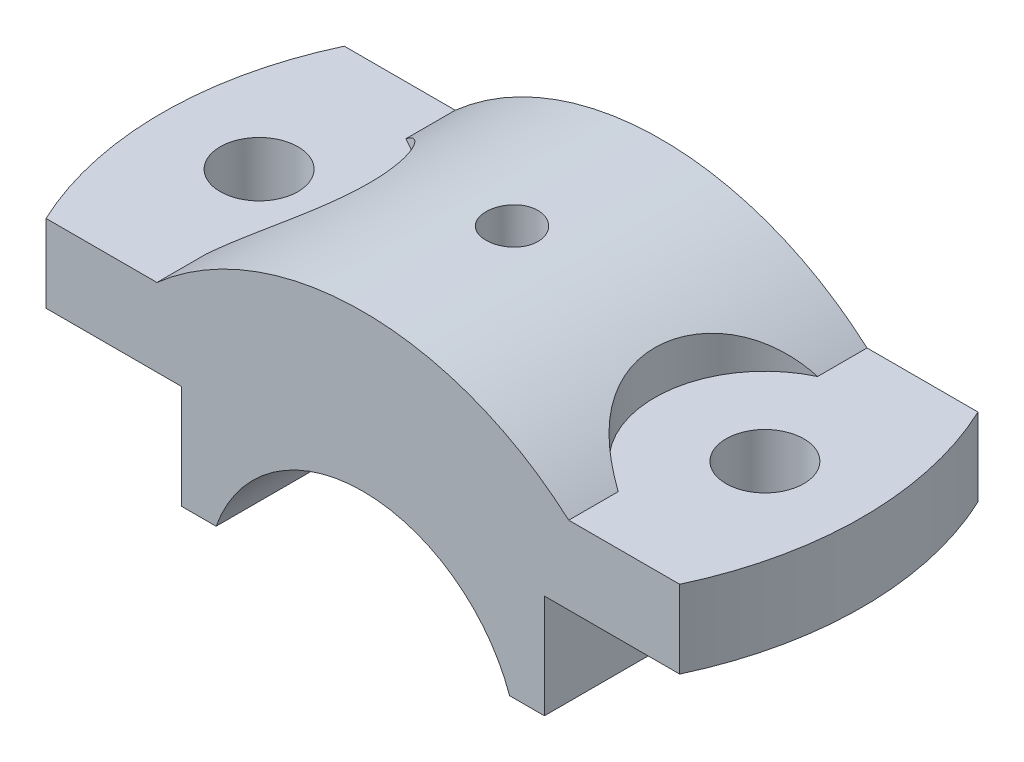
ISO-10303-21;
HEADER;
FILE_DESCRIPTION(('STEP AP214'),'2;1');
FILE_NAME('part.step','',(''),(''),'','','');
FILE_SCHEMA(('AUTOMOTIVE_DESIGN { 1 0 10303 214 1 1 1 1 }'));
ENDSEC;
DATA;
#1=APPLICATION_CONTEXT('core data for automotive mechanical design processes');
#2=APPLICATION_PROTOCOL_DEFINITION('international standard','automotive_design',2000,#1);
#3=PRODUCT_CONTEXT('',#1,'mechanical');
#4=PRODUCT('Part','Part','',(#3));
#5=PRODUCT_RELATED_PRODUCT_CATEGORY('part','',(#4));
#6=PRODUCT_DEFINITION_FORMATION('','',#4);
#7=PRODUCT_DEFINITION_CONTEXT('part definition',#1,'design');
#8=PRODUCT_DEFINITION('design','',#6,#7);
#9=PRODUCT_DEFINITION_SHAPE('','',#8);
#10=(LENGTH_UNIT() NAMED_UNIT(*) SI_UNIT(.MILLI.,.METRE.));
#11=(NAMED_UNIT(*) PLANE_ANGLE_UNIT() SI_UNIT($,.RADIAN.));
#12=(NAMED_UNIT(*) SI_UNIT($,.STERADIAN.) SOLID_ANGLE_UNIT());
#13=UNCERTAINTY_MEASURE_WITH_UNIT(LENGTH_MEASURE(1.E-05),#10,'distance_accuracy_value','');
#14=(GEOMETRIC_REPRESENTATION_CONTEXT(3) GLOBAL_UNCERTAINTY_ASSIGNED_CONTEXT((#13)) GLOBAL_UNIT_ASSIGNED_CONTEXT((#10,
#11,#12)) REPRESENTATION_CONTEXT('',''));
#15=CARTESIAN_POINT('',(0.,0.,0.));
#16=DIRECTION('',(0.,0.,1.));
#17=DIRECTION('',(1.,0.,0.));
#18=AXIS2_PLACEMENT_3D('',#15,#16,#17);
#19=CARTESIAN_POINT('',(0.,-16.,0.));
#20=DIRECTION('',(0.,1.,0.));
#21=DIRECTION('',(0.,0.,1.));
#22=AXIS2_PLACEMENT_3D('',#19,#20,#21);
#23=CYLINDRICAL_SURFACE('',#22,3.);
#24=CARTESIAN_POINT('',(0.,0.,2.99999999999989));
#25=CARTESIAN_POINT('',(-0.167809314666925,-2.34124285282648E-06,2.99999287087702));
#26=CARTESIAN_POINT('',(-0.335723489163323,-0.00177858534120809,2.98587254499684));
#27=CARTESIAN_POINT('',(-0.666879362507734,-0.00869351866368343,2.92976669451505));
#28=CARTESIAN_POINT('',(-0.830115996748512,-0.0138357187028007,2.88775207449186));
#29=CARTESIAN_POINT('',(-1.14707468977568,-0.0269032674670727,2.777114827303));
#30=CARTESIAN_POINT('',(-1.3008030721754,-0.0348267425334952,2.70851010982813));
#31=CARTESIAN_POINT('',(-1.59453536987169,-0.0525755894628661,2.54667925923625));
#32=CARTESIAN_POINT('',(-1.73454163386769,-0.0624006349906302,2.45345734976314));
#33=CARTESIAN_POINT('',(-1.99765538031762,-0.0829161443240986,2.24448966019248));
#34=CARTESIAN_POINT('',(-2.12067643792458,-0.0936106236910096,2.12863544478449));
#35=CARTESIAN_POINT('',(-2.345583352269,-0.11462728788302,1.87792461175601));
#36=CARTESIAN_POINT('',(-2.44746813167071,-0.124949453708809,1.74306702610409));
#37=CARTESIAN_POINT('',(-2.62753219354073,-0.144092332565006,1.4576160269212));
#38=CARTESIAN_POINT('',(-2.70563051512928,-0.152907873865083,1.30697116611847));
#39=CARTESIAN_POINT('',(-2.83538769189013,-0.167986458507823,0.994575537663192));
#40=CARTESIAN_POINT('',(-2.88704754967826,-0.174249598642391,0.83282519142362));
#41=CARTESIAN_POINT('',(-2.96219877602972,-0.183475924756665,0.50370696529592));
#42=CARTESIAN_POINT('',(-2.98583605767803,-0.186456198759096,0.336372890754994));
#43=CARTESIAN_POINT('',(-3.00472265946868,-0.188831662286497,8.84838338013145E-05));
#44=CARTESIAN_POINT('',(-2.99997312120293,-0.188226995981864,-0.16886178327756));
#45=CARTESIAN_POINT('',(-2.96234068373751,-0.183516535562941,-0.502565792698541));
#46=CARTESIAN_POINT('',(-2.92961851558165,-0.179430744476067,-0.667337983440298));
#47=CARTESIAN_POINT('',(-2.83722045981847,-0.168249602908488,-0.989034025462718));
#48=CARTESIAN_POINT('',(-2.77754402610229,-0.161154191451328,-1.14595771765675));
#49=CARTESIAN_POINT('',(-2.63275867189401,-0.144730609624185,-1.44800159882593));
#50=CARTESIAN_POINT('',(-2.54757990444922,-0.135396321462685,-1.59308796029872));
#51=CARTESIAN_POINT('',(-2.35425776334833,-0.115551462832858,-1.86696803329584));
#52=CARTESIAN_POINT('',(-2.2461133392969,-0.105040838572076,-1.99576099916834));
#53=CARTESIAN_POINT('',(-2.00903893290448,-0.0839386813149285,-2.23433125286723));
#54=CARTESIAN_POINT('',(-1.87997040940799,-0.0733470913573495,-2.34397091011915));
#55=CARTESIAN_POINT('',(-1.60518860293672,-0.0533444093297723,-2.54005065603669));
#56=CARTESIAN_POINT('',(-1.45947528158194,-0.0439333199819089,-2.62649069120646));
#57=CARTESIAN_POINT('',(-1.15543400563622,-0.0273461733770146,-2.77371758455675));
#58=CARTESIAN_POINT('',(-0.997101834405292,-0.0201708671815613,-2.83449582465749));
#59=CARTESIAN_POINT('',(-0.67236952851729,-0.00887057063930211,-2.92856459222787));
#60=CARTESIAN_POINT('',(-0.505969771956821,-0.0047454374896157,-2.9618564065644));
#61=CARTESIAN_POINT('',(-0.171015796696215,-2.88430709210897E-05,-2.99982890911262));
#62=CARTESIAN_POINT('',(-0.00248338823834651,0.000586033711596729,-3.00469919083687));
#63=CARTESIAN_POINT('',(0.332995243796977,-0.00172394393485412,-2.98619071913288));
#64=CARTESIAN_POINT('',(0.499941501077628,-0.00464872298145566,-2.96281256729812));
#65=CARTESIAN_POINT('',(0.826949409265802,-0.013694774919713,-2.88862834947076));
#66=CARTESIAN_POINT('',(0.987031884509617,-0.0198055102336021,-2.83791268391685));
#67=CARTESIAN_POINT('',(1.29641958583007,-0.0345393227976434,-2.71058705770451));
#68=CARTESIAN_POINT('',(1.44572444575838,-0.0431624853525068,-2.63397621781031));
#69=CARTESIAN_POINT('',(1.7301654248249,-0.0620181250786363,-2.45657623499108));
#70=CARTESIAN_POINT('',(1.86522451193256,-0.0722586714898925,-2.35566445223326));
#71=CARTESIAN_POINT('',(2.11655638755155,-0.0931782920921583,-2.13270060295899));
#72=CARTESIAN_POINT('',(2.23282843000421,-0.103857383677274,-2.01064769729887));
#73=CARTESIAN_POINT('',(2.4439583505816,-0.124522734449034,-1.74803109989151));
#74=CARTESIAN_POINT('',(2.53869055268148,-0.134504703344098,-1.6073659844276));
#75=CARTESIAN_POINT('',(2.70318346733217,-0.152575067554229,-1.31201010617441));
#76=CARTESIAN_POINT('',(2.77294468047402,-0.160663500827701,-1.15731962462825));
#77=CARTESIAN_POINT('',(2.88531189463984,-0.174001795284092,-0.838709617022925));
#78=CARTESIAN_POINT('',(2.92798875294853,-0.179259057782567,-0.674815403942471));
#79=CARTESIAN_POINT('',(2.98520399264141,-0.186361009110554,-0.342117019463194));
#80=CARTESIAN_POINT('',(2.99974368304291,-0.18820585669468,-0.173313076849172));
#81=CARTESIAN_POINT('',(3.0002478433018,-0.18826947621054,0.163162715045651));
#82=CARTESIAN_POINT('',(2.98640975723914,-0.186513302976572,0.330834297998293));
#83=CARTESIAN_POINT('',(2.93096928581918,-0.179626625553606,0.66144855521409));
#84=CARTESIAN_POINT('',(2.88936689748687,-0.174496121003041,0.82439122897053));
#85=CARTESIAN_POINT('',(2.77964048842754,-0.161446610705414,1.14089634811966));
#86=CARTESIAN_POINT('',(2.71152597716511,-0.153528604886608,1.29446213402618));
#87=CARTESIAN_POINT('',(2.55072828258037,-0.135794601062196,1.588015984858));
#88=CARTESIAN_POINT('',(2.45804479141149,-0.125978579275079,1.72800387962382));
#89=CARTESIAN_POINT('',(2.25000759751896,-0.105472742973237,1.99143747040859));
#90=CARTESIAN_POINT('',(2.13450675092991,-0.094777534991636,2.114766553146));
#91=CARTESIAN_POINT('',(1.88442027236202,-0.073766020885196,2.34036819020162));
#92=CARTESIAN_POINT('',(1.74983014696984,-0.0634498046928832,2.44263577292924));
#93=CARTESIAN_POINT('',(1.46479874502501,-0.04431532095902,2.6235424285264));
#94=CARTESIAN_POINT('',(1.31429913551536,-0.0355028990604096,2.70209016707912));
#95=CARTESIAN_POINT('',(1.00221948276152,-0.0204282110793104,2.83268549149955));
#96=CARTESIAN_POINT('',(0.840651697044306,-0.0141631755650562,2.88476187162419));
#97=CARTESIAN_POINT('',(0.565206926361551,-0.00639935606702067,2.94847120580561));
#98=CARTESIAN_POINT('',(0.453066796220337,-0.00401128925456732,2.96776673037851));
#99=CARTESIAN_POINT('',(0.227300475854938,-0.000810824049763366,2.99353349483183));
#100=CARTESIAN_POINT('',(0.113674296595242,1.58596163140247E-06,3.00000482927906));
#101=CARTESIAN_POINT('',(0.,0.,2.99999999999989));
#102=B_SPLINE_CURVE_WITH_KNOTS('',3,(#24,#25,#26,#27,#28,#29,#30,#31,#32,#33,#34,#35,#36,#37,
#38,#39,#40,#41,#42,#43,#44,#45,#46,#47,#48,#49,#50,#51,#52,#53,#54,#55,#56,#57,#58,#59,#60,#61,
#62,#63,#64,#65,#66,#67,#68,#69,#70,#71,#72,#73,#74,#75,#76,#77,#78,#79,#80,#81,#82,#83,#84,#85,
#86,#87,#88,#89,#90,#91,#92,#93,#94,#95,#96,#97,#98,#99,#100,#101),.UNSPECIFIED.,.T.,.F.,(4,2,2,
2,2,2,2,2,2,2,2,2,2,2,2,2,2,2,2,2,2,2,2,2,2,2,2,2,2,2,2,2,2,2,2,2,2,2,4),(0.,0.503012727331519,
1.00655095313214,1.50975060981815,2.0128639870929,2.51844975842213,3.02406129360013,
3.5313750038264,4.03866947396162,4.54331070343582,5.04793163861597,5.54967235730025,
6.05142324199477,6.55456111542631,7.05772200616363,7.56436173763698,8.07100263735734,
8.57781354877921,9.08460073084532,9.58800335270302,10.0913952540231,10.5931326467207,
11.0948870769473,11.599228835141,12.103590616501,12.6108236580908,13.1180465306584,
13.6239368913711,14.1298037161275,14.6321628144266,15.1345219665545,15.6367010964779,
16.1388865189472,16.644422852302,17.1500783816402,17.6576568364423,18.1646819842084,
18.5054261182515,18.8461677396052),.UNSPECIFIED.);
#103=CARTESIAN_POINT('',(0.,0.,2.99999999999989));
#104=VERTEX_POINT('',#103);
#105=EDGE_CURVE('E337',#104,#104,#102,.T.);
#106=ORIENTED_EDGE('',*,*,#105,.T.);
#107=EDGE_LOOP('',(#106));
#108=FACE_BOUND('',#107,.T.);
#109=CARTESIAN_POINT('',(0.,8.00000000000001,0.));
#110=DIRECTION('',(0.,1.,0.));
#111=DIRECTION('',(0.,0.,1.));
#112=AXIS2_PLACEMENT_3D('',#109,#110,#111);
#113=CIRCLE('',#112,3.);
#114=CARTESIAN_POINT('',(0.,8.00000000000001,3.));
#115=VERTEX_POINT('',#114);
#116=EDGE_CURVE('E345',#115,#115,#113,.F.);
#117=ORIENTED_EDGE('',*,*,#116,.F.);
#118=EDGE_LOOP('',(#117));
#119=FACE_BOUND('',#118,.T.);
#120=ADVANCED_FACE('F43',(#108,#119),#23,.F.);
#121=CARTESIAN_POINT('',(0.,-24.,-87.621977685614));
#122=DIRECTION('',(0.,0.,1.));
#123=DIRECTION('',(1.,0.,0.));
#124=AXIS2_PLACEMENT_3D('',#121,#122,#123);
#125=CYLINDRICAL_SURFACE('',#124,48.);
#126=CARTESIAN_POINT('',(0.,24.,4.));
#127=CARTESIAN_POINT('',(0.224264359684817,23.9999978164607,3.99999020469489));
#128=CARTESIAN_POINT('',(0.448681388720903,23.9984115417359,3.98107612075584));
#129=CARTESIAN_POINT('',(0.89130628280155,23.99223609313,3.90590259257967));
#130=CARTESIAN_POINT('',(1.1095068209009,23.9876435172678,3.84960083878032));
#131=CARTESIAN_POINT('',(1.53322409005702,23.9759744498441,3.70129138476245));
#132=CARTESIAN_POINT('',(1.73874792169845,23.9688993639394,3.60930388756071));
#133=CARTESIAN_POINT('',(2.13138893366429,23.9530587097885,3.39227027251206));
#134=CARTESIAN_POINT('',(2.31851003954153,23.9442935032543,3.26723122609003));
#135=CARTESIAN_POINT('',(2.66955999986234,23.9260311946685,2.98729973357608));
#136=CARTESIAN_POINT('',(2.83343548966463,23.9165324834631,2.83234046425729));
#137=CARTESIAN_POINT('',(3.13288453414622,23.8978872321267,2.49710841660024));
#138=CARTESIAN_POINT('',(3.26845684548604,23.8887407074815,2.31683452678944));
#139=CARTESIAN_POINT('',(3.50763168956092,23.8718181064497,1.93576753160381));
#140=CARTESIAN_POINT('',(3.61118733180617,23.8640440472037,1.73494489838886));
#141=CARTESIAN_POINT('',(3.78308973509539,23.8507649779309,1.31868681777608));
#142=CARTESIAN_POINT('',(3.85143711804971,23.8452599278252,1.10325162856705));
#143=CARTESIAN_POINT('',(3.95082811927432,23.8371556826528,0.664418432475385));
#144=CARTESIAN_POINT('',(3.98195866155911,23.8345497174487,0.441040240029685));
#145=CARTESIAN_POINT('',(4.00630083206169,23.832517292859,-0.00778481578137484));
#146=CARTESIAN_POINT('',(3.99951317191813,23.8330907738024,-0.233231640243924));
#147=CARTESIAN_POINT('',(3.94828345685938,23.8373462944655,-0.679198662042014));
#148=CARTESIAN_POINT('',(3.90393587215223,23.8410205351141,-0.899729796305594));
#149=CARTESIAN_POINT('',(3.77899194153178,23.8510513427746,-1.33020746957179));
#150=CARTESIAN_POINT('',(3.69839524158717,23.8574079359839,-1.5401539051754));
#151=CARTESIAN_POINT('',(3.50313515260815,23.8720961882741,-1.9438036235124));
#152=CARTESIAN_POINT('',(3.38842937902876,23.8804303020385,-2.13748631035005));
#153=CARTESIAN_POINT('',(3.12823777565335,23.8981322745552,-2.50288535527928));
#154=CARTESIAN_POINT('',(2.98275132249014,23.9075001542412,-2.67460126838897));
#155=CARTESIAN_POINT('',(2.6645983289054,23.9262488164658,-2.99174167712636));
#156=CARTESIAN_POINT('',(2.49185011756221,23.9356295510026,-3.13708425651706));
#157=CARTESIAN_POINT('',(2.12436222548692,23.9533196747933,-3.39671889355427));
#158=CARTESIAN_POINT('',(1.9296225300613,23.9616290633314,-3.51101093045434));
#159=CARTESIAN_POINT('',(1.52362637307139,23.9762418323856,-3.70529505067492));
#160=CARTESIAN_POINT('',(1.31236816723627,23.9825450006977,-3.78528350591266));
#161=CARTESIAN_POINT('',(0.879356276078311,23.9924326964719,-3.90863252980529));
#162=CARTESIAN_POINT('',(0.657602808675426,23.9960172803554,-3.95199385862102));
#163=CARTESIAN_POINT('',(0.210605200657015,24.000056677722,-4.00075505616631));
#164=CARTESIAN_POINT('',(-0.0146265164607891,24.00052081968,-4.00626807242761));
#165=CARTESIAN_POINT('',(-0.462811010013239,23.998291951148,-3.97947255749071));
#166=CARTESIAN_POINT('',(-0.685763807685683,23.995598970107,-3.94716437908208));
#167=CARTESIAN_POINT('',(-1.12273902489884,23.9873647136528,-3.84573736555953));
#168=CARTESIAN_POINT('',(-1.33677370055894,23.9818274966968,-3.77667097589671));
#169=CARTESIAN_POINT('',(-1.75021666033001,23.968526804494,-3.60374164887188));
#170=CARTESIAN_POINT('',(-1.94962471313258,23.9607632940497,-3.499878161366));
#171=CARTESIAN_POINT('',(-2.32866887320764,23.9438570557453,-3.26001860313458));
#172=CARTESIAN_POINT('',(-2.50825740208586,23.9347111287494,-3.1239475744207));
#173=CARTESIAN_POINT('',(-2.84208437937444,23.9160783455879,-2.82364377179811));
#174=CARTESIAN_POINT('',(-2.9963223872575,23.9065914835011,-2.65941050860301));
#175=CARTESIAN_POINT('',(-3.27545818182037,23.8883184486329,-2.30695323120673));
#176=CARTESIAN_POINT('',(-3.40028213293451,23.8795340749689,-2.11867063521046));
#177=CARTESIAN_POINT('',(-3.61654025135806,23.8636860697728,-1.72375094854637));
#178=CARTESIAN_POINT('',(-3.70797475203989,23.8566224210607,-1.51711404116027));
#179=CARTESIAN_POINT('',(-3.85473270976229,23.8450257139577,-1.09161283784306));
#180=CARTESIAN_POINT('',(-3.91010136579716,23.8404894891454,-0.872764221142673));
#181=CARTESIAN_POINT('',(-3.98330307964062,23.834450627634,-0.428837200502284));
#182=CARTESIAN_POINT('',(-4.00113685827311,23.8329479326787,-0.2037589162816));
#183=CARTESIAN_POINT('',(-3.99875425156376,23.8331471180078,0.2455045040836));
#184=CARTESIAN_POINT('',(-3.97865387910956,23.8348392277227,0.469690268945764));
#185=CARTESIAN_POINT('',(-3.90121545318012,23.8412166032922,0.91149013420342));
#186=CARTESIAN_POINT('',(-3.84387734291056,23.8459018737118,1.12910422457538));
#187=CARTESIAN_POINT('',(-3.6936204400683,23.8577350852682,1.5515910530665));
#188=CARTESIAN_POINT('',(-3.60070373602614,23.8648828818476,1.75646453826277));
#189=CARTESIAN_POINT('',(-3.38194023578897,23.8808359950028,2.14772336229469));
#190=CARTESIAN_POINT('',(-3.2560939564582,23.8896412855619,2.33410899125333));
#191=CARTESIAN_POINT('',(-2.97460776848978,23.9079492679473,2.68369495605207));
#192=CARTESIAN_POINT('',(-2.81888197496584,23.9174539202297,2.84682603462942));
#193=CARTESIAN_POINT('',(-2.48221290236986,23.9360718003871,3.14470074081324));
#194=CARTESIAN_POINT('',(-2.30126353056436,23.945184932993,3.27943748998396));
#195=CARTESIAN_POINT('',(-1.91893509211767,23.962009393691,3.51687944167016));
#196=CARTESIAN_POINT('',(-1.7175186250822,23.9697180809241,3.61952455462528));
#197=CARTESIAN_POINT('',(-1.30038300798299,23.982834100652,3.7894072122051));
#198=CARTESIAN_POINT('',(-1.08468062165464,23.9882440771302,3.85668545715234));
#199=CARTESIAN_POINT('',(-0.723088192386746,23.994764309354,3.93679033000813));
#200=CARTESIAN_POINT('',(-0.57952357775391,23.9967187550781,3.96046245006993));
#201=CARTESIAN_POINT('',(-0.290660686004667,23.9993373063453,3.99207043870883));
#202=CARTESIAN_POINT('',(-0.145362413492189,24.0000014153143,4.00000634906588));
#203=CARTESIAN_POINT('',(0.,24.,4.));
#204=B_SPLINE_CURVE_WITH_KNOTS('',3,(#126,#127,#128,#129,#130,#131,#132,#133,#134,#135,#136,
#137,#138,#139,#140,#141,#142,#143,#144,#145,#146,#147,#148,#149,#150,#151,#152,#153,#154,#155,
#156,#157,#158,#159,#160,#161,#162,#163,#164,#165,#166,#167,#168,#169,#170,#171,#172,#173,#174,
#175,#176,#177,#178,#179,#180,#181,#182,#183,#184,#185,#186,#187,#188,#189,#190,#191,#192,#193,
#194,#195,#196,#197,#198,#199,#200,#201,#202,#203),.UNSPECIFIED.,.T.,.F.,(4,2,2,2,2,2,2,2,2,2,2,
2,2,2,2,2,2,2,2,2,2,2,2,2,2,2,2,2,2,2,2,2,2,2,2,2,2,2,4),(0.,0.672262347200549,1.34528675599135,
2.01793069555579,2.69043083833664,3.36445067514305,4.03850011495735,4.71353211804367,
5.38855219711595,6.06199259326336,6.73542035050467,7.40715932441154,8.07890485907993,
8.75148862995601,9.42408602323452,10.0987380374061,10.7733905023459,11.4481143036181,
12.1228241013014,12.7955159722868,13.4682015685689,14.1399299612315,14.8116689744549,
15.484986998997,16.1583167228499,16.833319059648,17.5083146567931,18.1824626896372,
18.8565977759504,19.5286745153011,20.2007522796936,20.872790597901,21.5448183683943,
22.2188075465856,22.8929598092992,23.5683669225021,24.2429950636714,24.6787394542665,
25.1144826879499),.UNSPECIFIED.);
#205=CARTESIAN_POINT('',(0.,24.,4.));
#206=VERTEX_POINT('',#205);
#207=EDGE_CURVE('E11',#206,#206,#204,.T.);
#208=ORIENTED_EDGE('',*,*,#207,.F.);
#209=EDGE_LOOP('',(#208));
#210=FACE_BOUND('',#209,.T.);
#211=DIRECTION('',(0.,0.,1.));
#212=VECTOR('',#211,1.);
#213=CARTESIAN_POINT('',(-31.7490157327751,12.,-87.621977685614));
#214=LINE('',#213,#212);
#215=CARTESIAN_POINT('',(-31.7490157327751,12.,-22.9999999999999));
#216=VERTEX_POINT('',#215);
#217=CARTESIAN_POINT('',(-31.7490157327752,12.,-15.3760601961768));
#218=VERTEX_POINT('',#217);
#219=EDGE_CURVE('E156',#216,#218,#214,.T.);
#220=ORIENTED_EDGE('',*,*,#219,.T.);
#221=CARTESIAN_POINT('',(-31.7490157327751,12.,-15.3760601961765));
#222=CARTESIAN_POINT('',(-31.5666993606048,12.1607910344816,-15.2900831270754));
#223=CARTESIAN_POINT('',(-31.3842407385663,12.3192382806886,-15.2000764321767));
#224=CARTESIAN_POINT('',(-31.0194382984914,12.6312986785064,-15.0117552307287));
#225=CARTESIAN_POINT('',(-30.8370944958099,12.7849112802083,-14.9134397837669));
#226=CARTESIAN_POINT('',(-30.2906545114744,13.2384242405059,-14.6055515958539));
#227=CARTESIAN_POINT('',(-29.9273932433292,13.5307855559239,-14.3831506648982));
#228=CARTESIAN_POINT('',(-29.2055877678828,14.0952057641667,-13.9017498917576));
#229=CARTESIAN_POINT('',(-28.8470773519232,14.3671527207169,-13.6425680163444));
#230=CARTESIAN_POINT('',(-28.1414563178618,14.8876660950044,-13.0879067788257));
#231=CARTESIAN_POINT('',(-27.7943424142725,15.1362392903486,-12.792437996369));
#232=CARTESIAN_POINT('',(-27.1144372728569,15.6103537782901,-12.1634340928701));
#233=CARTESIAN_POINT('',(-26.7817440960143,15.8357484531289,-11.8296819039895));
#234=CARTESIAN_POINT('',(-26.1381758530123,16.2609560521935,-11.1265718110925));
#235=CARTESIAN_POINT('',(-25.8273031949563,16.4607661549158,-10.7572099878544));
#236=CARTESIAN_POINT('',(-25.2335249148575,16.8337098769773,-9.98600624774975));
#237=CARTESIAN_POINT('',(-24.9505424988563,17.0069175240425,-9.58425938846286));
#238=CARTESIAN_POINT('',(-24.4165226257608,17.3271148139075,-8.75027197863356));
#239=CARTESIAN_POINT('',(-24.165480267083,17.4741084809499,-8.3180361228558));
#240=CARTESIAN_POINT('',(-23.7269538102758,17.7263466257883,-7.47873214327798));
#241=CARTESIAN_POINT('',(-23.535471816767,17.8344606926746,-7.07460691096117));
#242=CARTESIAN_POINT('',(-23.1835604410674,18.0305023424913,-6.24834535649088));
#243=CARTESIAN_POINT('',(-23.0231288276401,18.1184313759742,-5.82621033115814));
#244=CARTESIAN_POINT('',(-22.7354708993115,18.2744033380662,-4.96694066927086));
#245=CARTESIAN_POINT('',(-22.608263014144,18.3424352319097,-4.52979785912621));
#246=CARTESIAN_POINT('',(-22.3889311500727,18.4588178093571,-3.64423461983413));
#247=CARTESIAN_POINT('',(-22.2968060905276,18.5071690991774,-3.19581453850934));
#248=CARTESIAN_POINT('',(-22.1535573681311,18.5819913104556,-2.31986442510426));
#249=CARTESIAN_POINT('',(-22.1002179585565,18.6096478774008,-1.89279604525902));
#250=CARTESIAN_POINT('',(-22.0260840023336,18.6480173220226,-1.03510100849045));
#251=CARTESIAN_POINT('',(-22.0052877863416,18.6587310688026,-0.604474535223168));
#252=CARTESIAN_POINT('',(-21.9964874817102,18.6632694542849,0.257033751988876));
#253=CARTESIAN_POINT('',(-22.0084707600267,18.6571005994522,0.687915403598025));
#254=CARTESIAN_POINT('',(-22.0650595375991,18.6278566152431,1.54695674796917));
#255=CARTESIAN_POINT('',(-22.1096651361626,18.6047814344011,1.97511643244104));
#256=CARTESIAN_POINT('',(-22.2301596888934,18.5420325739505,2.81994764060117));
#257=CARTESIAN_POINT('',(-22.3056259308811,18.5025830752486,3.23669621522414));
#258=CARTESIAN_POINT('',(-22.4869158657055,18.4069464217795,4.06157204983092));
#259=CARTESIAN_POINT('',(-22.5927390819872,18.3507595297615,4.4696994450452));
#260=CARTESIAN_POINT('',(-22.8334963082056,18.2214412118201,5.27452238868249));
#261=CARTESIAN_POINT('',(-22.9684306191341,18.1483096106975,5.67121781885752));
#262=CARTESIAN_POINT('',(-23.2658059297839,17.9848905587104,6.45050946606177));
#263=CARTESIAN_POINT('',(-23.4282471429062,17.8946029747475,6.83310557367916));
#264=CARTESIAN_POINT('',(-23.7802108235912,17.6958360657888,7.58497168737228));
#265=CARTESIAN_POINT('',(-23.9699550727257,17.5872063549857,7.95409805630076));
#266=CARTESIAN_POINT('',(-24.3731485080022,17.3521952355226,8.67324372694079));
#267=CARTESIAN_POINT('',(-24.5865977528722,17.2258137828835,9.02326298131224));
#268=CARTESIAN_POINT('',(-25.0346129932483,16.9552998874379,9.70223622389618));
#269=CARTESIAN_POINT('',(-25.2691774101921,16.8111687712935,10.0311917836812));
#270=CARTESIAN_POINT('',(-25.7566603032744,16.5052741270816,10.6665029899039));
#271=CARTESIAN_POINT('',(-26.0095789285025,16.3435104557808,10.972858452722));
#272=CARTESIAN_POINT('',(-26.5418842805158,15.9954208539865,11.5742533465983));
#273=CARTESIAN_POINT('',(-26.8219376643438,15.8083462352714,11.8682688661708));
#274=CARTESIAN_POINT('',(-27.3955194624365,15.4158125971756,12.4296869015502));
#275=CARTESIAN_POINT('',(-27.6890490642934,15.2103519560056,12.697087065274));
#276=CARTESIAN_POINT('',(-28.2863824379904,14.7816416595242,13.2050051767953));
#277=CARTESIAN_POINT('',(-28.5901897214682,14.5583858879775,13.4455138130627));
#278=CARTESIAN_POINT('',(-29.2047776474054,14.0950011657592,13.8996257253556));
#279=CARTESIAN_POINT('',(-29.5155567818031,13.8548758405909,14.1132347550932));
#280=CARTESIAN_POINT('',(-30.1465409740784,13.3543930550497,14.5175420543306));
#281=CARTESIAN_POINT('',(-30.4668164417767,13.0937608790559,14.7077886938378));
#282=CARTESIAN_POINT('',(-31.1079315091614,12.5577863535063,15.0615091701434));
#283=CARTESIAN_POINT('',(-31.4287665224092,12.2824905558249,15.2250617322874));
#284=CARTESIAN_POINT('',(-31.7490157327751,12.,15.3760601961772));
#285=B_SPLINE_CURVE_WITH_KNOTS('',3,(#221,#222,#223,#224,#225,#226,#227,#228,#229,#230,#231,
#232,#233,#234,#235,#236,#237,#238,#239,#240,#241,#242,#243,#244,#245,#246,#247,#248,#249,#250,
#251,#252,#253,#254,#255,#256,#257,#258,#259,#260,#261,#262,#263,#264,#265,#266,#267,#268,#269,
#270,#271,#272,#273,#274,#275,#276,#277,#278,#279,#280,#281,#282,#283,#284),.UNSPECIFIED.,.F.,
.F.,(4,2,2,2,2,2,2,2,2,2,2,2,2,2,2,2,2,2,2,2,2,2,2,2,2,2,2,2,2,2,2,4),(0.,0.773458025682374,
1.54700371148749,3.09512332277503,4.65119082007947,6.20680570955181,7.77172305062609,
9.33681282467522,10.8974652129591,12.4578778108563,13.8363264835486,15.2146760660573,
16.5937886249588,17.9728587002062,19.2651269606079,20.5573289303254,21.8490329624021,
23.140740926661,24.4153187748838,25.6898766154091,26.9644476347565,28.2390285427914,
29.5246179289052,30.8102105000725,32.0957070405172,33.3812140241149,34.7209972321287,
36.0608987360839,37.4012627703213,38.7413396176213,40.1042161588978,41.4629977344694),.UNSPECIFIED.);
#286=CARTESIAN_POINT('',(-31.7490157327751,12.,15.3760601961772));
#287=VERTEX_POINT('',#286);
#288=EDGE_CURVE('E60',#218,#287,#285,.T.);
#289=ORIENTED_EDGE('',*,*,#288,.T.);
#290=CARTESIAN_POINT('',(-31.7490157327751,12.,22.9999999999999));
#291=VERTEX_POINT('',#290);
#292=EDGE_CURVE('E157',#287,#291,#214,.T.);
#293=ORIENTED_EDGE('',*,*,#292,.T.);
#294=CARTESIAN_POINT('',(0.,-24.,22.9999999999999));
#295=DIRECTION('',(0.,0.,1.));
#296=DIRECTION('',(1.,0.,0.));
#297=AXIS2_PLACEMENT_3D('',#294,#295,#296);
#298=CIRCLE('',#297,48.);
#299=CARTESIAN_POINT('',(31.7490157327751,12.,22.9999999999999));
#300=VERTEX_POINT('',#299);
#301=EDGE_CURVE('E177',#300,#291,#298,.T.);
#302=ORIENTED_EDGE('',*,*,#301,.F.);
#303=DIRECTION('',(0.,0.,1.));
#304=VECTOR('',#303,1.);
#305=CARTESIAN_POINT('',(31.7490157327751,12.,-87.621977685614));
#306=LINE('',#305,#304);
#307=CARTESIAN_POINT('',(31.7490157327751,12.,15.376060196177));
#308=VERTEX_POINT('',#307);
#309=EDGE_CURVE('E166',#308,#300,#306,.T.);
#310=ORIENTED_EDGE('',*,*,#309,.F.);
#311=CARTESIAN_POINT('',(31.7490157327751,12.,15.376060196177));
#312=CARTESIAN_POINT('',(31.5666993606049,12.1607910344816,15.2900831270757));
#313=CARTESIAN_POINT('',(31.3842407385664,12.3192382806885,15.200076432177));
#314=CARTESIAN_POINT('',(31.0194382984914,12.6312986785064,15.0117552307289));
#315=CARTESIAN_POINT('',(30.83709449581,12.7849112802083,14.9134397837671));
#316=CARTESIAN_POINT('',(30.2906545114745,13.2384242405059,14.6055515958542));
#317=CARTESIAN_POINT('',(29.9273932433292,13.5307855559238,14.3831506648985));
#318=CARTESIAN_POINT('',(29.2055877678829,14.0952057641667,13.9017498917579));
#319=CARTESIAN_POINT('',(28.8470773519233,14.3671527207168,13.6425680163447));
#320=CARTESIAN_POINT('',(28.1414563178619,14.8876660950044,13.0879067788259));
#321=CARTESIAN_POINT('',(27.7943424142726,15.1362392903486,12.7924379963692));
#322=CARTESIAN_POINT('',(27.114437272857,15.6103537782901,12.1634340928703));
#323=CARTESIAN_POINT('',(26.7817440960143,15.8357484531289,11.8296819039897));
#324=CARTESIAN_POINT('',(26.1381758530123,16.2609560521935,11.1265718110928));
#325=CARTESIAN_POINT('',(25.8273031949563,16.4607661549158,10.7572099878546));
#326=CARTESIAN_POINT('',(25.2335249148575,16.8337098769773,9.98600624774999));
#327=CARTESIAN_POINT('',(24.9505424988563,17.0069175240425,9.5842593884631));
#328=CARTESIAN_POINT('',(24.4165226257608,17.3271148139075,8.75027197863379));
#329=CARTESIAN_POINT('',(24.165480267083,17.4741084809499,8.31803612285603));
#330=CARTESIAN_POINT('',(23.7269538102758,17.7263466257883,7.47873214327821));
#331=CARTESIAN_POINT('',(23.5354718167671,17.8344606926746,7.07460691096142));
#332=CARTESIAN_POINT('',(23.1835604410675,18.0305023424913,6.24834535649117));
#333=CARTESIAN_POINT('',(23.0231288276401,18.1184313759742,5.82621033115845));
#334=CARTESIAN_POINT('',(22.7354708993116,18.2744033380662,4.9669406692712));
#335=CARTESIAN_POINT('',(22.6082630141441,18.3424352319096,4.52979785912656));
#336=CARTESIAN_POINT('',(22.3889311500728,18.458817809357,3.64423461983453));
#337=CARTESIAN_POINT('',(22.2968060905276,18.5071690991774,3.19581453850977));
#338=CARTESIAN_POINT('',(22.1535573681311,18.5819913104556,2.31986442510469));
#339=CARTESIAN_POINT('',(22.1002179585565,18.6096478774007,1.89279604525943));
#340=CARTESIAN_POINT('',(22.0260840023336,18.6480173220226,1.03510100849081));
#341=CARTESIAN_POINT('',(22.0052877863416,18.6587310688026,0.604474535223514));
#342=CARTESIAN_POINT('',(21.9964874817102,18.6632694542849,-0.257033751988566));
#343=CARTESIAN_POINT('',(22.0084707600267,18.6571005994522,-0.687915403597734));
#344=CARTESIAN_POINT('',(22.065059537599,18.6278566152431,-1.54695674796892));
#345=CARTESIAN_POINT('',(22.1096651361626,18.6047814344011,-1.9751164324408));
#346=CARTESIAN_POINT('',(22.2301596888934,18.5420325739505,-2.81994764060093));
#347=CARTESIAN_POINT('',(22.3056259308811,18.5025830752486,-3.23669621522388));
#348=CARTESIAN_POINT('',(22.4869158657055,18.4069464217795,-4.06157204983062));
#349=CARTESIAN_POINT('',(22.5927390819872,18.3507595297616,-4.46969944504488));
#350=CARTESIAN_POINT('',(22.8334963082055,18.2214412118201,-5.27452238868215));
#351=CARTESIAN_POINT('',(22.968430619134,18.1483096106975,-5.67121781885718));
#352=CARTESIAN_POINT('',(23.2658059297839,17.9848905587104,-6.45050946606138));
#353=CARTESIAN_POINT('',(23.4282471429062,17.8946029747475,-6.83310557367873));
#354=CARTESIAN_POINT('',(23.7802108235912,17.6958360657888,-7.58497168737186));
#355=CARTESIAN_POINT('',(23.9699550727257,17.5872063549857,-7.95409805630039));
#356=CARTESIAN_POINT('',(24.3731485080022,17.3521952355227,-8.67324372694048));
#357=CARTESIAN_POINT('',(24.5865977528721,17.2258137828835,-9.02326298131194));
#358=CARTESIAN_POINT('',(25.0346129932482,16.9552998874379,-9.7022362238959));
#359=CARTESIAN_POINT('',(25.2691774101921,16.8111687712936,-10.0311917836809));
#360=CARTESIAN_POINT('',(25.7566603032744,16.5052741270816,-10.6665029899036));
#361=CARTESIAN_POINT('',(26.0095789285025,16.3435104557808,-10.9728584527218));
#362=CARTESIAN_POINT('',(26.5418842805158,15.9954208539865,-11.5742533465981));
#363=CARTESIAN_POINT('',(26.8219376643438,15.8083462352715,-11.8682688661706));
#364=CARTESIAN_POINT('',(27.3955194624365,15.4158125971756,-12.4296869015499));
#365=CARTESIAN_POINT('',(27.6890490642934,15.2103519560056,-12.6970870652737));
#366=CARTESIAN_POINT('',(28.2863824379904,14.7816416595243,-13.205005176795));
#367=CARTESIAN_POINT('',(28.5901897214681,14.5583858879776,-13.4455138130624));
#368=CARTESIAN_POINT('',(29.2047776474053,14.0950011657592,-13.8996257253554));
#369=CARTESIAN_POINT('',(29.515556781803,13.8548758405909,-14.113234755093));
#370=CARTESIAN_POINT('',(30.1465409740783,13.3543930550497,-14.5175420543304));
#371=CARTESIAN_POINT('',(30.4668164417767,13.0937608790559,-14.7077886938376));
#372=CARTESIAN_POINT('',(31.1079315091614,12.5577863535064,-15.0615091701432));
#373=CARTESIAN_POINT('',(31.4287665224092,12.282490555825,-15.2250617322871));
#374=CARTESIAN_POINT('',(31.7490157327751,12.,-15.376060196177));
#375=B_SPLINE_CURVE_WITH_KNOTS('',3,(#311,#312,#313,#314,#315,#316,#317,#318,#319,#320,#321,
#322,#323,#324,#325,#326,#327,#328,#329,#330,#331,#332,#333,#334,#335,#336,#337,#338,#339,#340,
#341,#342,#343,#344,#345,#346,#347,#348,#349,#350,#351,#352,#353,#354,#355,#356,#357,#358,#359,
#360,#361,#362,#363,#364,#365,#366,#367,#368,#369,#370,#371,#372,#373,#374),.UNSPECIFIED.,.F.,
.F.,(4,2,2,2,2,2,2,2,2,2,2,2,2,2,2,2,2,2,2,2,2,2,2,2,2,2,2,2,2,2,2,4),(0.,0.773458025682366,
1.54700371148749,3.09512332277501,4.65119082007946,6.20680570955181,7.77172305062611,
9.33681282467526,10.8974652129592,12.4578778108563,13.8363264835486,15.2146760660572,
16.5937886249587,17.9728587002061,19.2651269606078,20.5573289303254,21.8490329624022,
23.1407409266611,24.4153187748838,25.6898766154091,26.9644476347565,28.2390285427912,
29.5246179289052,30.8102105000725,32.0957070405173,33.381214024115,34.7209972321288,
36.0608987360839,37.4012627703213,38.7413396176213,40.1042161588978,41.4629977344695),.UNSPECIFIED.);
#376=CARTESIAN_POINT('',(31.7490157327751,12.,-15.376060196177));
#377=VERTEX_POINT('',#376);
#378=EDGE_CURVE('E155',#308,#377,#375,.T.);
#379=ORIENTED_EDGE('',*,*,#378,.T.);
#380=CARTESIAN_POINT('',(31.7490157327751,12.,-22.9999999999999));
#381=VERTEX_POINT('',#380);
#382=EDGE_CURVE('E173',#381,#377,#306,.T.);
#383=ORIENTED_EDGE('',*,*,#382,.F.);
#384=CARTESIAN_POINT('',(0.,-24.,-22.9999999999999));
#385=DIRECTION('',(0.,0.,1.));
#386=DIRECTION('',(1.,0.,0.));
#387=AXIS2_PLACEMENT_3D('',#384,#385,#386);
#388=CIRCLE('',#387,48.);
#389=EDGE_CURVE('E170',#216,#381,#388,.F.);
#390=ORIENTED_EDGE('',*,*,#389,.F.);
#391=EDGE_LOOP('',(#220,#289,#293,#302,#310,#379,#383,#390));
#392=FACE_BOUND('',#391,.T.);
#393=ADVANCED_FACE('F163',(#210,#392),#125,.T.);
#394=CARTESIAN_POINT('',(0.,12.,0.));
#395=DIRECTION('',(0.,1.,0.));
#396=DIRECTION('',(0.,0.,1.));
#397=AXIS2_PLACEMENT_3D('',#394,#395,#396);
#398=PLANE('',#397);
#399=CARTESIAN_POINT('',(39.,12.,0.));
#400=DIRECTION('',(0.,1.,0.));
#401=DIRECTION('',(0.,0.,1.));
#402=AXIS2_PLACEMENT_3D('',#399,#400,#401);
#403=CIRCLE('',#402,6.);
#404=CARTESIAN_POINT('',(39.,12.,6.));
#405=VERTEX_POINT('',#404);
#406=EDGE_CURVE('E288',#405,#405,#403,.T.);
#407=ORIENTED_EDGE('',*,*,#406,.F.);
#408=EDGE_LOOP('',(#407));
#409=FACE_BOUND('',#408,.T.);
#410=DIRECTION('',(-1.,0.,0.));
#411=VECTOR('',#410,1.);
#412=CARTESIAN_POINT('',(-48.8569340012244,12.,-22.9999999999999));
#413=LINE('',#412,#411);
#414=CARTESIAN_POINT('',(48.8569340012244,12.,-22.9999999999999));
#415=VERTEX_POINT('',#414);
#416=EDGE_CURVE('E241',#415,#381,#413,.T.);
#417=ORIENTED_EDGE('',*,*,#416,.T.);
#418=ORIENTED_EDGE('',*,*,#382,.T.);
#419=CARTESIAN_POINT('',(39.,12.,0.));
#420=DIRECTION('',(0.,1.,0.));
#421=DIRECTION('',(0.,0.,1.));
#422=AXIS2_PLACEMENT_3D('',#419,#420,#421);
#423=CIRCLE('',#422,17.);
#424=EDGE_CURVE('E64',#377,#308,#423,.T.);
#425=ORIENTED_EDGE('',*,*,#424,.T.);
#426=ORIENTED_EDGE('',*,*,#309,.T.);
#427=DIRECTION('',(1.,0.,0.));
#428=VECTOR('',#427,1.);
#429=CARTESIAN_POINT('',(-48.8569340012244,12.,22.9999999999999));
#430=LINE('',#429,#428);
#431=CARTESIAN_POINT('',(48.8569340012244,12.,22.9999999999999));
#432=VERTEX_POINT('',#431);
#433=EDGE_CURVE('E235',#300,#432,#430,.T.);
#434=ORIENTED_EDGE('',*,*,#433,.T.);
#435=CARTESIAN_POINT('',(0.,12.,0.));
#436=DIRECTION('',(0.,1.,0.));
#437=DIRECTION('',(0.,0.,1.));
#438=AXIS2_PLACEMENT_3D('',#435,#436,#437);
#439=CIRCLE('',#438,54.);
#440=EDGE_CURVE('E240',#432,#415,#439,.T.);
#441=ORIENTED_EDGE('',*,*,#440,.T.);
#442=EDGE_LOOP('',(#417,#418,#425,#426,#434,#441));
#443=FACE_BOUND('',#442,.T.);
#444=ADVANCED_FACE('F328',(#409,#443),#398,.T.);
#445=CARTESIAN_POINT('',(0.,0.,0.));
#446=DIRECTION('',(0.,1.,0.));
#447=DIRECTION('',(0.,0.,1.));
#448=AXIS2_PLACEMENT_3D('',#445,#446,#447);
#449=PLANE('',#448);
#450=CARTESIAN_POINT('',(-39.,0.,2.22044604925031E-13));
#451=DIRECTION('',(0.,1.,0.));
#452=DIRECTION('',(0.,0.,1.));
#453=AXIS2_PLACEMENT_3D('',#450,#451,#452);
#454=CIRCLE('',#453,6.);
#455=CARTESIAN_POINT('',(-39.,0.,6.00000000000023));
#456=VERTEX_POINT('',#455);
#457=EDGE_CURVE('E290',#456,#456,#454,.T.);
#458=ORIENTED_EDGE('',*,*,#457,.T.);
#459=EDGE_LOOP('',(#458));
#460=FACE_BOUND('',#459,.T.);
#461=DIRECTION('',(-1.,0.,0.));
#462=VECTOR('',#461,1.);
#463=CARTESIAN_POINT('',(-48.8569340012244,0.,-22.9999999999999));
#464=LINE('',#463,#462);
#465=CARTESIAN_POINT('',(-28.,0.,-22.9999999999999));
#466=VERTEX_POINT('',#465);
#467=CARTESIAN_POINT('',(-48.8569340012244,0.,-22.9999999999999));
#468=VERTEX_POINT('',#467);
#469=EDGE_CURVE('E258',#466,#468,#464,.T.);
#470=ORIENTED_EDGE('',*,*,#469,.F.);
#471=DIRECTION('',(0.,0.,1.));
#472=VECTOR('',#471,1.);
#473=CARTESIAN_POINT('',(-28.,0.,0.));
#474=LINE('',#473,#472);
#475=CARTESIAN_POINT('',(-28.,0.,22.9999999999999));
#476=VERTEX_POINT('',#475);
#477=EDGE_CURVE('E276',#466,#476,#474,.T.);
#478=ORIENTED_EDGE('',*,*,#477,.T.);
#479=DIRECTION('',(1.,0.,0.));
#480=VECTOR('',#479,1.);
#481=CARTESIAN_POINT('',(-48.8569340012244,0.,22.9999999999999));
#482=LINE('',#481,#480);
#483=CARTESIAN_POINT('',(-48.8569340012244,0.,22.9999999999999));
#484=VERTEX_POINT('',#483);
#485=EDGE_CURVE('E249',#484,#476,#482,.T.);
#486=ORIENTED_EDGE('',*,*,#485,.F.);
#487=CARTESIAN_POINT('',(0.,0.,0.));
#488=DIRECTION('',(0.,1.,0.));
#489=DIRECTION('',(0.,0.,1.));
#490=AXIS2_PLACEMENT_3D('',#487,#488,#489);
#491=CIRCLE('',#490,54.);
#492=EDGE_CURVE('E227',#468,#484,#491,.T.);
#493=ORIENTED_EDGE('',*,*,#492,.F.);
#494=EDGE_LOOP('',(#470,#478,#486,#493));
#495=FACE_BOUND('',#494,.T.);
#496=ADVANCED_FACE('F371',(#460,#495),#449,.F.);
#497=CARTESIAN_POINT('',(0.,12.,0.));
#498=DIRECTION('',(0.,-1.,0.));
#499=DIRECTION('',(0.,0.,-1.));
#500=AXIS2_PLACEMENT_3D('',#497,#498,#499);
#501=CYLINDRICAL_SURFACE('',#500,54.);
#502=ORIENTED_EDGE('',*,*,#492,.T.);
#503=DIRECTION('',(0.,-1.,0.));
#504=VECTOR('',#503,1.);
#505=CARTESIAN_POINT('',(-48.8569340012244,12.,22.9999999999999));
#506=LINE('',#505,#504);
#507=CARTESIAN_POINT('',(-48.8569340012244,12.,22.9999999999999));
#508=VERTEX_POINT('',#507);
#509=EDGE_CURVE('E271',#508,#484,#506,.T.);
#510=ORIENTED_EDGE('',*,*,#509,.F.);
#511=CARTESIAN_POINT('',(0.,12.,0.));
#512=DIRECTION('',(0.,1.,0.));
#513=DIRECTION('',(0.,0.,1.));
#514=AXIS2_PLACEMENT_3D('',#511,#512,#513);
#515=CIRCLE('',#514,54.);
#516=CARTESIAN_POINT('',(-48.8569340012244,12.,-22.9999999999999));
#517=VERTEX_POINT('',#516);
#518=EDGE_CURVE('E229',#517,#508,#515,.T.);
#519=ORIENTED_EDGE('',*,*,#518,.F.);
#520=DIRECTION('',(0.,-1.,0.));
#521=VECTOR('',#520,1.);
#522=CARTESIAN_POINT('',(-48.8569340012244,12.,-22.9999999999999));
#523=LINE('',#522,#521);
#524=EDGE_CURVE('E243',#517,#468,#523,.T.);
#525=ORIENTED_EDGE('',*,*,#524,.T.);
#526=EDGE_LOOP('',(#502,#510,#519,#525));
#527=FACE_BOUND('',#526,.T.);
#528=ADVANCED_FACE('F44',(#527),#501,.T.);
#529=CARTESIAN_POINT('',(-48.8569340012244,12.,22.9999999999999));
#530=DIRECTION('',(0.,0.,-1.));
#531=DIRECTION('',(-1.,0.,0.));
#532=AXIS2_PLACEMENT_3D('',#529,#530,#531);
#533=PLANE('',#532);
#534=ORIENTED_EDGE('',*,*,#485,.T.);
#535=DIRECTION('',(0.,-1.,0.));
#536=VECTOR('',#535,1.);
#537=CARTESIAN_POINT('',(-28.,0.499999999999945,22.9999999999999));
#538=LINE('',#537,#536);
#539=CARTESIAN_POINT('',(-28.,-16.,22.9999999999999));
#540=VERTEX_POINT('',#539);
#541=EDGE_CURVE('E205',#476,#540,#538,.T.);
#542=ORIENTED_EDGE('',*,*,#541,.T.);
#543=DIRECTION('',(1.,0.,0.));
#544=VECTOR('',#543,1.);
#545=CARTESIAN_POINT('',(-28.,-16.,22.9999999999999));
#546=LINE('',#545,#544);
#547=CARTESIAN_POINT('',(-22.6274169979696,-16.,22.9999999999999));
#548=VERTEX_POINT('',#547);
#549=EDGE_CURVE('E202',#540,#548,#546,.T.);
#550=ORIENTED_EDGE('',*,*,#549,.T.);
#551=CARTESIAN_POINT('',(0.,-24.,22.9999999999999));
#552=DIRECTION('',(0.,0.,-1.));
#553=DIRECTION('',(1.,0.,0.));
#554=AXIS2_PLACEMENT_3D('',#551,#552,#553);
#555=CIRCLE('',#554,24.);
#556=CARTESIAN_POINT('',(22.6274169979696,-16.,22.9999999999999));
#557=VERTEX_POINT('',#556);
#558=EDGE_CURVE('E207',#548,#557,#555,.T.);
#559=ORIENTED_EDGE('',*,*,#558,.T.);
#560=DIRECTION('',(1.,0.,0.));
#561=VECTOR('',#560,1.);
#562=CARTESIAN_POINT('',(22.6274169979696,-16.,22.9999999999999));
#563=LINE('',#562,#561);
#564=CARTESIAN_POINT('',(28.,-16.,22.9999999999999));
#565=VERTEX_POINT('',#564);
#566=EDGE_CURVE('E194',#557,#565,#563,.T.);
#567=ORIENTED_EDGE('',*,*,#566,.T.);
#568=DIRECTION('',(0.,1.,0.));
#569=VECTOR('',#568,1.);
#570=CARTESIAN_POINT('',(28.,0.499999999999945,22.9999999999999));
#571=LINE('',#570,#569);
#572=CARTESIAN_POINT('',(28.,0.,22.9999999999999));
#573=VERTEX_POINT('',#572);
#574=EDGE_CURVE('E196',#565,#573,#571,.T.);
#575=ORIENTED_EDGE('',*,*,#574,.T.);
#576=CARTESIAN_POINT('',(48.8569340012244,0.,22.9999999999999));
#577=VERTEX_POINT('',#576);
#578=EDGE_CURVE('E248',#573,#577,#482,.T.);
#579=ORIENTED_EDGE('',*,*,#578,.T.);
#580=DIRECTION('',(0.,-1.,0.));
#581=VECTOR('',#580,1.);
#582=CARTESIAN_POINT('',(48.8569340012244,12.,22.9999999999999));
#583=LINE('',#582,#581);
#584=EDGE_CURVE('E270',#432,#577,#583,.T.);
#585=ORIENTED_EDGE('',*,*,#584,.F.);
#586=ORIENTED_EDGE('',*,*,#433,.F.);
#587=ORIENTED_EDGE('',*,*,#301,.T.);
#588=EDGE_CURVE('E234',#508,#291,#430,.T.);
#589=ORIENTED_EDGE('',*,*,#588,.F.);
#590=ORIENTED_EDGE('',*,*,#509,.T.);
#591=EDGE_LOOP('',(#534,#542,#550,#559,#567,#575,#579,#585,#586,#587,#589,#590));
#592=FACE_BOUND('',#591,.T.);
#593=ADVANCED_FACE('F380',(#592),#533,.F.);
#594=CARTESIAN_POINT('',(0.,12.,0.));
#595=DIRECTION('',(0.,-1.,0.));
#596=DIRECTION('',(0.,0.,-1.));
#597=AXIS2_PLACEMENT_3D('',#594,#595,#596);
#598=CYLINDRICAL_SURFACE('',#597,54.);
#599=CARTESIAN_POINT('',(0.,0.,0.));
#600=DIRECTION('',(0.,1.,0.));
#601=DIRECTION('',(0.,0.,1.));
#602=AXIS2_PLACEMENT_3D('',#599,#600,#601);
#603=CIRCLE('',#602,54.);
#604=CARTESIAN_POINT('',(48.8569340012244,0.,-22.9999999999999));
#605=VERTEX_POINT('',#604);
#606=EDGE_CURVE('E251',#577,#605,#603,.T.);
#607=ORIENTED_EDGE('',*,*,#606,.T.);
#608=DIRECTION('',(0.,-1.,0.));
#609=VECTOR('',#608,1.);
#610=CARTESIAN_POINT('',(48.8569340012244,12.,-22.9999999999999));
#611=LINE('',#610,#609);
#612=EDGE_CURVE('E263',#415,#605,#611,.T.);
#613=ORIENTED_EDGE('',*,*,#612,.F.);
#614=ORIENTED_EDGE('',*,*,#440,.F.);
#615=ORIENTED_EDGE('',*,*,#584,.T.);
#616=EDGE_LOOP('',(#607,#613,#614,#615));
#617=FACE_BOUND('',#616,.T.);
#618=ADVANCED_FACE('F372',(#617),#598,.T.);
#619=CARTESIAN_POINT('',(-48.8569340012244,12.,-22.9999999999999));
#620=DIRECTION('',(0.,0.,1.));
#621=DIRECTION('',(1.,0.,0.));
#622=AXIS2_PLACEMENT_3D('',#619,#620,#621);
#623=PLANE('',#622);
#624=CARTESIAN_POINT('',(28.,0.,-22.9999999999999));
#625=VERTEX_POINT('',#624);
#626=EDGE_CURVE('E233',#605,#625,#464,.T.);
#627=ORIENTED_EDGE('',*,*,#626,.T.);
#628=DIRECTION('',(0.,-1.,0.));
#629=VECTOR('',#628,1.);
#630=CARTESIAN_POINT('',(28.,0.499999999999945,-22.9999999999999));
#631=LINE('',#630,#629);
#632=CARTESIAN_POINT('',(28.,-16.,-22.9999999999999));
#633=VERTEX_POINT('',#632);
#634=EDGE_CURVE('E193',#625,#633,#631,.T.);
#635=ORIENTED_EDGE('',*,*,#634,.T.);
#636=DIRECTION('',(-1.,0.,0.));
#637=VECTOR('',#636,1.);
#638=CARTESIAN_POINT('',(22.6274169979696,-16.,-22.9999999999999));
#639=LINE('',#638,#637);
#640=CARTESIAN_POINT('',(22.6274169979696,-16.,-22.9999999999999));
#641=VERTEX_POINT('',#640);
#642=EDGE_CURVE('E190',#633,#641,#639,.T.);
#643=ORIENTED_EDGE('',*,*,#642,.T.);
#644=CARTESIAN_POINT('',(0.,-24.,-22.9999999999999));
#645=DIRECTION('',(0.,0.,1.));
#646=DIRECTION('',(1.,0.,0.));
#647=AXIS2_PLACEMENT_3D('',#644,#645,#646);
#648=CIRCLE('',#647,24.);
#649=CARTESIAN_POINT('',(-22.6274169979696,-16.,-22.9999999999999));
#650=VERTEX_POINT('',#649);
#651=EDGE_CURVE('E187',#641,#650,#648,.T.);
#652=ORIENTED_EDGE('',*,*,#651,.T.);
#653=DIRECTION('',(-1.,0.,0.));
#654=VECTOR('',#653,1.);
#655=CARTESIAN_POINT('',(-28.,-16.,-22.9999999999999));
#656=LINE('',#655,#654);
#657=CARTESIAN_POINT('',(-28.,-16.,-22.9999999999999));
#658=VERTEX_POINT('',#657);
#659=EDGE_CURVE('E181',#650,#658,#656,.T.);
#660=ORIENTED_EDGE('',*,*,#659,.T.);
#661=DIRECTION('',(0.,1.,0.));
#662=VECTOR('',#661,1.);
#663=CARTESIAN_POINT('',(-28.,0.499999999999945,-22.9999999999999));
#664=LINE('',#663,#662);
#665=EDGE_CURVE('E179',#658,#466,#664,.T.);
#666=ORIENTED_EDGE('',*,*,#665,.T.);
#667=ORIENTED_EDGE('',*,*,#469,.T.);
#668=ORIENTED_EDGE('',*,*,#524,.F.);
#669=EDGE_CURVE('E238',#216,#517,#413,.T.);
#670=ORIENTED_EDGE('',*,*,#669,.F.);
#671=ORIENTED_EDGE('',*,*,#389,.T.);
#672=ORIENTED_EDGE('',*,*,#416,.F.);
#673=ORIENTED_EDGE('',*,*,#612,.T.);
#674=EDGE_LOOP('',(#627,#635,#643,#652,#660,#666,#667,#668,#670,#671,#672,#673));
#675=FACE_BOUND('',#674,.T.);
#676=ADVANCED_FACE('F368',(#675),#623,.F.);
#677=CARTESIAN_POINT('',(-39.,12.,2.22044604925031E-13));
#678=DIRECTION('',(0.,1.,0.));
#679=DIRECTION('',(0.,0.,-1.));
#680=AXIS2_PLACEMENT_3D('',#677,#678,#679);
#681=CIRCLE('',#680,6.);
#682=CARTESIAN_POINT('',(-39.,12.,-5.99999999999978));
#683=VERTEX_POINT('',#682);
#684=EDGE_CURVE('E161',#683,#683,#681,.T.);
#685=ORIENTED_EDGE('',*,*,#684,.F.);
#686=EDGE_LOOP('',(#685));
#687=FACE_BOUND('',#686,.T.);
#688=ORIENTED_EDGE('',*,*,#219,.F.);
#689=ORIENTED_EDGE('',*,*,#669,.T.);
#690=ORIENTED_EDGE('',*,*,#518,.T.);
#691=ORIENTED_EDGE('',*,*,#588,.T.);
#692=ORIENTED_EDGE('',*,*,#292,.F.);
#693=CARTESIAN_POINT('',(-39.,12.,2.22044604925031E-13));
#694=DIRECTION('',(0.,1.,0.));
#695=DIRECTION('',(0.,0.,-1.));
#696=AXIS2_PLACEMENT_3D('',#693,#694,#695);
#697=CIRCLE('',#696,17.);
#698=EDGE_CURVE('E66',#287,#218,#697,.T.);
#699=ORIENTED_EDGE('',*,*,#698,.T.);
#700=EDGE_LOOP('',(#688,#689,#690,#691,#692,#699));
#701=FACE_BOUND('',#700,.T.);
#702=ADVANCED_FACE('F154',(#687,#701),#398,.T.);
#703=CARTESIAN_POINT('',(39.,0.,0.));
#704=DIRECTION('',(0.,1.,0.));
#705=DIRECTION('',(0.,0.,1.));
#706=AXIS2_PLACEMENT_3D('',#703,#704,#705);
#707=CIRCLE('',#706,6.);
#708=CARTESIAN_POINT('',(39.,0.,6.));
#709=VERTEX_POINT('',#708);
#710=EDGE_CURVE('E284',#709,#709,#707,.T.);
#711=ORIENTED_EDGE('',*,*,#710,.T.);
#712=EDGE_LOOP('',(#711));
#713=FACE_BOUND('',#712,.T.);
#714=ORIENTED_EDGE('',*,*,#578,.F.);
#715=DIRECTION('',(0.,0.,-1.));
#716=VECTOR('',#715,1.);
#717=CARTESIAN_POINT('',(28.,0.,0.));
#718=LINE('',#717,#716);
#719=EDGE_CURVE('E274',#573,#625,#718,.T.);
#720=ORIENTED_EDGE('',*,*,#719,.T.);
#721=ORIENTED_EDGE('',*,*,#626,.F.);
#722=ORIENTED_EDGE('',*,*,#606,.F.);
#723=EDGE_LOOP('',(#714,#720,#721,#722));
#724=FACE_BOUND('',#723,.T.);
#725=ADVANCED_FACE('F346',(#713,#724),#449,.F.);
#726=CARTESIAN_POINT('',(0.,-24.,-81.3802192527571));
#727=DIRECTION('',(0.,0.,1.));
#728=DIRECTION('',(1.,0.,0.));
#729=AXIS2_PLACEMENT_3D('',#726,#727,#728);
#730=CYLINDRICAL_SURFACE('',#729,24.);
#731=ORIENTED_EDGE('',*,*,#105,.F.);
#732=EDGE_LOOP('',(#731));
#733=FACE_BOUND('',#732,.T.);
#734=DIRECTION('',(0.,0.,1.));
#735=VECTOR('',#734,1.);
#736=CARTESIAN_POINT('',(-22.6274169979696,-16.,-81.3802192527571));
#737=LINE('',#736,#735);
#738=EDGE_CURVE('E216',#650,#548,#737,.T.);
#739=ORIENTED_EDGE('',*,*,#738,.F.);
#740=ORIENTED_EDGE('',*,*,#651,.F.);
#741=DIRECTION('',(0.,0.,1.));
#742=VECTOR('',#741,1.);
#743=CARTESIAN_POINT('',(22.6274169979696,-16.,-81.3802192527571));
#744=LINE('',#743,#742);
#745=EDGE_CURVE('E184',#641,#557,#744,.T.);
#746=ORIENTED_EDGE('',*,*,#745,.T.);
#747=ORIENTED_EDGE('',*,*,#558,.F.);
#748=EDGE_LOOP('',(#739,#740,#746,#747));
#749=FACE_BOUND('',#748,.T.);
#750=ADVANCED_FACE('F343',(#733,#749),#730,.F.);
#751=CARTESIAN_POINT('',(-28.,0.499999999999945,-81.3802192527571));
#752=DIRECTION('',(-1.,0.,0.));
#753=DIRECTION('',(0.,0.,1.));
#754=AXIS2_PLACEMENT_3D('',#751,#752,#753);
#755=PLANE('',#754);
#756=ORIENTED_EDGE('',*,*,#477,.F.);
#757=ORIENTED_EDGE('',*,*,#665,.F.);
#758=DIRECTION('',(0.,0.,1.));
#759=VECTOR('',#758,1.);
#760=CARTESIAN_POINT('',(-28.,-16.,-81.3802192527571));
#761=LINE('',#760,#759);
#762=EDGE_CURVE('E218',#658,#540,#761,.T.);
#763=ORIENTED_EDGE('',*,*,#762,.T.);
#764=ORIENTED_EDGE('',*,*,#541,.F.);
#765=EDGE_LOOP('',(#756,#757,#763,#764));
#766=FACE_BOUND('',#765,.T.);
#767=ADVANCED_FACE('F350',(#766),#755,.T.);
#768=CARTESIAN_POINT('',(28.,0.499999999999945,-81.3802192527571));
#769=DIRECTION('',(1.,0.,0.));
#770=DIRECTION('',(0.,0.,-1.));
#771=AXIS2_PLACEMENT_3D('',#768,#769,#770);
#772=PLANE('',#771);
#773=ORIENTED_EDGE('',*,*,#719,.F.);
#774=ORIENTED_EDGE('',*,*,#574,.F.);
#775=DIRECTION('',(0.,0.,1.));
#776=VECTOR('',#775,1.);
#777=CARTESIAN_POINT('',(28.,-16.,-81.3802192527571));
#778=LINE('',#777,#776);
#779=EDGE_CURVE('E215',#633,#565,#778,.T.);
#780=ORIENTED_EDGE('',*,*,#779,.F.);
#781=ORIENTED_EDGE('',*,*,#634,.F.);
#782=EDGE_LOOP('',(#773,#774,#780,#781));
#783=FACE_BOUND('',#782,.T.);
#784=ADVANCED_FACE('F357',(#783),#772,.T.);
#785=CARTESIAN_POINT('',(22.6274169979696,-16.,-81.3802192527571));
#786=DIRECTION('',(0.,-1.,0.));
#787=DIRECTION('',(0.,0.,-1.));
#788=AXIS2_PLACEMENT_3D('',#785,#786,#787);
#789=PLANE('',#788);
#790=ORIENTED_EDGE('',*,*,#642,.F.);
#791=ORIENTED_EDGE('',*,*,#779,.T.);
#792=ORIENTED_EDGE('',*,*,#566,.F.);
#793=ORIENTED_EDGE('',*,*,#745,.F.);
#794=EDGE_LOOP('',(#790,#791,#792,#793));
#795=FACE_BOUND('',#794,.T.);
#796=ADVANCED_FACE('F352',(#795),#789,.T.);
#797=CARTESIAN_POINT('',(-28.,-16.,-81.3802192527571));
#798=DIRECTION('',(0.,-1.,0.));
#799=DIRECTION('',(0.,0.,-1.));
#800=AXIS2_PLACEMENT_3D('',#797,#798,#799);
#801=PLANE('',#800);
#802=ORIENTED_EDGE('',*,*,#659,.F.);
#803=ORIENTED_EDGE('',*,*,#738,.T.);
#804=ORIENTED_EDGE('',*,*,#549,.F.);
#805=ORIENTED_EDGE('',*,*,#762,.F.);
#806=EDGE_LOOP('',(#802,#803,#804,#805));
#807=FACE_BOUND('',#806,.T.);
#808=ADVANCED_FACE('F311',(#807),#801,.T.);
#809=CARTESIAN_POINT('',(39.,-16.,0.));
#810=DIRECTION('',(0.,1.,0.));
#811=DIRECTION('',(0.,0.,1.));
#812=AXIS2_PLACEMENT_3D('',#809,#810,#811);
#813=CYLINDRICAL_SURFACE('',#812,6.);
#814=ORIENTED_EDGE('',*,*,#406,.T.);
#815=EDGE_LOOP('',(#814));
#816=FACE_BOUND('',#815,.T.);
#817=ORIENTED_EDGE('',*,*,#710,.F.);
#818=EDGE_LOOP('',(#817));
#819=FACE_BOUND('',#818,.T.);
#820=ADVANCED_FACE('F313',(#816,#819),#813,.F.);
#821=CARTESIAN_POINT('',(-39.,-16.,2.22044604925031E-13));
#822=DIRECTION('',(0.,1.,0.));
#823=DIRECTION('',(0.,0.,1.));
#824=AXIS2_PLACEMENT_3D('',#821,#822,#823);
#825=CYLINDRICAL_SURFACE('',#824,6.);
#826=ORIENTED_EDGE('',*,*,#684,.T.);
#827=EDGE_LOOP('',(#826));
#828=FACE_BOUND('',#827,.T.);
#829=ORIENTED_EDGE('',*,*,#457,.F.);
#830=EDGE_LOOP('',(#829));
#831=FACE_BOUND('',#830,.T.);
#832=ADVANCED_FACE('F306',(#828,#831),#825,.F.);
#833=CARTESIAN_POINT('',(39.,24.,0.));
#834=DIRECTION('',(0.,-1.,0.));
#835=DIRECTION('',(0.,0.,-1.));
#836=AXIS2_PLACEMENT_3D('',#833,#834,#835);
#837=CYLINDRICAL_SURFACE('',#836,17.);
#838=ORIENTED_EDGE('',*,*,#424,.F.);
#839=ORIENTED_EDGE('',*,*,#378,.F.);
#840=EDGE_LOOP('',(#838,#839));
#841=FACE_BOUND('',#840,.T.);
#842=ADVANCED_FACE('F304',(#841),#837,.F.);
#843=CARTESIAN_POINT('',(-39.,24.,2.22044604925031E-13));
#844=DIRECTION('',(0.,-1.,0.));
#845=DIRECTION('',(0.,0.,-1.));
#846=AXIS2_PLACEMENT_3D('',#843,#844,#845);
#847=CYLINDRICAL_SURFACE('',#846,17.);
#848=ORIENTED_EDGE('',*,*,#698,.F.);
#849=ORIENTED_EDGE('',*,*,#288,.F.);
#850=EDGE_LOOP('',(#848,#849));
#851=FACE_BOUND('',#850,.T.);
#852=ADVANCED_FACE('F150',(#851),#847,.F.);
#853=CARTESIAN_POINT('',(0.,8.00000000000001,0.));
#854=DIRECTION('',(0.,1.,0.));
#855=DIRECTION('',(0.,0.,1.));
#856=AXIS2_PLACEMENT_3D('',#853,#854,#855);
#857=PLANE('',#856);
#858=CARTESIAN_POINT('',(0.,8.00000000000001,0.));
#859=DIRECTION('',(0.,1.,0.));
#860=DIRECTION('',(0.,0.,1.));
#861=AXIS2_PLACEMENT_3D('',#858,#859,#860);
#862=CIRCLE('',#861,4.);
#863=CARTESIAN_POINT('',(0.,8.00000000000001,4.));
#864=VERTEX_POINT('',#863);
#865=EDGE_CURVE('E476',#864,#864,#862,.T.);
#866=ORIENTED_EDGE('',*,*,#865,.T.);
#867=EDGE_LOOP('',(#866));
#868=FACE_BOUND('',#867,.T.);
#869=ORIENTED_EDGE('',*,*,#116,.T.);
#870=EDGE_LOOP('',(#869));
#871=FACE_BOUND('',#870,.T.);
#872=ADVANCED_FACE('F487',(#868,#871),#857,.T.);
#873=CARTESIAN_POINT('',(0.,8.00000000000001,0.));
#874=DIRECTION('',(0.,1.,0.));
#875=DIRECTION('',(0.,0.,1.));
#876=AXIS2_PLACEMENT_3D('',#873,#874,#875);
#877=CYLINDRICAL_SURFACE('',#876,4.);
#878=ORIENTED_EDGE('',*,*,#207,.T.);
#879=EDGE_LOOP('',(#878));
#880=FACE_BOUND('',#879,.T.);
#881=ORIENTED_EDGE('',*,*,#865,.F.);
#882=EDGE_LOOP('',(#881));
#883=FACE_BOUND('',#882,.T.);
#884=ADVANCED_FACE('F331',(#880,#883),#877,.F.);
#885=CLOSED_SHELL('',(#120,#393,#444,#496,#528,#593,#618,#676,#702,#725,#750,#767,#784,#796,
#808,#820,#832,#842,#852,#872,#884));
#886=MANIFOLD_SOLID_BREP('B2',#885);
#887=ADVANCED_BREP_SHAPE_REPRESENTATION('',(#18,#886),#14);
#888=SHAPE_DEFINITION_REPRESENTATION(#9,#887);
ENDSEC;
END-ISO-10303-21;
